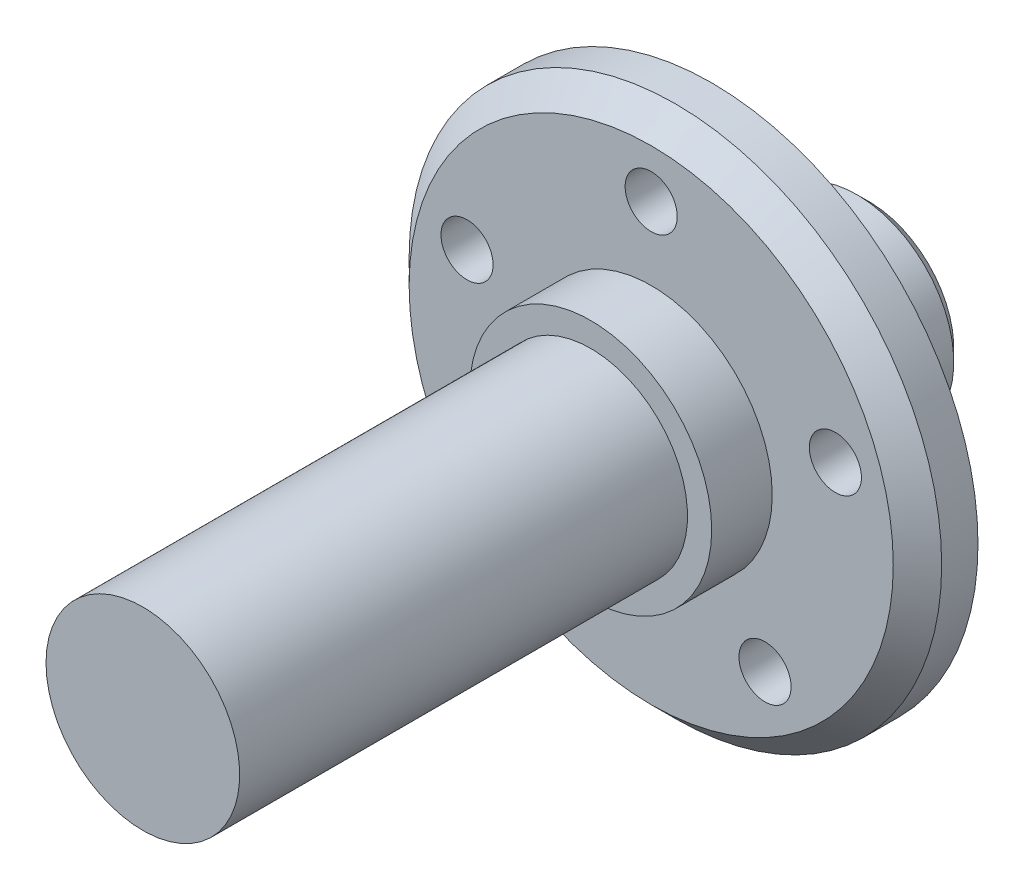
ISO-10303-21;
HEADER;
FILE_DESCRIPTION(('STEP AP214'),'2;1');
FILE_NAME('part.step','',(''),(''),'','','');
FILE_SCHEMA(('AUTOMOTIVE_DESIGN { 1 0 10303 214 1 1 1 1 }'));
ENDSEC;
DATA;
#1=APPLICATION_CONTEXT('core data for automotive mechanical design processes');
#2=APPLICATION_PROTOCOL_DEFINITION('international standard','automotive_design',2000,#1);
#3=PRODUCT_CONTEXT('',#1,'mechanical');
#4=PRODUCT('Part','Part','',(#3));
#5=PRODUCT_RELATED_PRODUCT_CATEGORY('part','',(#4));
#6=PRODUCT_DEFINITION_FORMATION('','',#4);
#7=PRODUCT_DEFINITION_CONTEXT('part definition',#1,'design');
#8=PRODUCT_DEFINITION('design','',#6,#7);
#9=PRODUCT_DEFINITION_SHAPE('','',#8);
#10=(LENGTH_UNIT() NAMED_UNIT(*) SI_UNIT(.MILLI.,.METRE.));
#11=(NAMED_UNIT(*) PLANE_ANGLE_UNIT() SI_UNIT($,.RADIAN.));
#12=(NAMED_UNIT(*) SI_UNIT($,.STERADIAN.) SOLID_ANGLE_UNIT());
#13=UNCERTAINTY_MEASURE_WITH_UNIT(LENGTH_MEASURE(1.E-05),#10,'distance_accuracy_value','');
#14=(GEOMETRIC_REPRESENTATION_CONTEXT(3) GLOBAL_UNCERTAINTY_ASSIGNED_CONTEXT((#13)) GLOBAL_UNIT_ASSIGNED_CONTEXT((#10,
#11,#12)) REPRESENTATION_CONTEXT('',''));
#15=CARTESIAN_POINT('',(0.,0.,0.));
#16=DIRECTION('',(0.,0.,1.));
#17=DIRECTION('',(1.,0.,0.));
#18=AXIS2_PLACEMENT_3D('',#15,#16,#17);
#19=CARTESIAN_POINT('',(0.,0.,0.));
#20=DIRECTION('',(0.,0.,1.));
#21=DIRECTION('',(1.,0.,0.));
#22=AXIS2_PLACEMENT_3D('',#19,#20,#21);
#23=PLANE('',#22);
#24=CARTESIAN_POINT('',(0.,0.,0.));
#25=DIRECTION('',(0.,0.,-1.));
#26=DIRECTION('',(-1.,0.,0.));
#27=AXIS2_PLACEMENT_3D('',#24,#25,#26);
#28=CIRCLE('',#27,8.);
#29=CARTESIAN_POINT('',(-8.,0.,0.));
#30=VERTEX_POINT('',#29);
#31=EDGE_CURVE('E81',#30,#30,#28,.T.);
#32=ORIENTED_EDGE('',*,*,#31,.F.);
#33=EDGE_LOOP('',(#32));
#34=FACE_BOUND('',#33,.T.);
#35=ADVANCED_FACE('F39',(#34),#23,.T.);
#36=CARTESIAN_POINT('',(0.,0.,-60.));
#37=DIRECTION('',(0.,0.,-1.));
#38=DIRECTION('',(-1.,0.,0.));
#39=AXIS2_PLACEMENT_3D('',#36,#37,#38);
#40=CYLINDRICAL_SURFACE('',#39,8.);
#41=ORIENTED_EDGE('',*,*,#31,.T.);
#42=EDGE_LOOP('',(#41));
#43=FACE_BOUND('',#42,.T.);
#44=CARTESIAN_POINT('',(0.,0.,-37.));
#45=DIRECTION('',(0.,0.,-1.));
#46=DIRECTION('',(-1.,0.,0.));
#47=AXIS2_PLACEMENT_3D('',#44,#45,#46);
#48=CIRCLE('',#47,8.);
#49=CARTESIAN_POINT('',(-8.,0.,-37.));
#50=VERTEX_POINT('',#49);
#51=EDGE_CURVE('E84',#50,#50,#48,.T.);
#52=ORIENTED_EDGE('',*,*,#51,.F.);
#53=EDGE_LOOP('',(#52));
#54=FACE_BOUND('',#53,.T.);
#55=ADVANCED_FACE('F137',(#43,#54),#40,.T.);
#56=CARTESIAN_POINT('',(-8.,0.,-37.));
#57=DIRECTION('',(0.,0.,1.));
#58=DIRECTION('',(1.,0.,0.));
#59=AXIS2_PLACEMENT_3D('',#56,#57,#58);
#60=PLANE('',#59);
#61=ORIENTED_EDGE('',*,*,#51,.T.);
#62=EDGE_LOOP('',(#61));
#63=FACE_BOUND('',#62,.T.);
#64=CARTESIAN_POINT('',(0.,0.,-37.));
#65=DIRECTION('',(0.,0.,-1.));
#66=DIRECTION('',(-1.,0.,0.));
#67=AXIS2_PLACEMENT_3D('',#64,#65,#66);
#68=CIRCLE('',#67,10.);
#69=CARTESIAN_POINT('',(-9.99999999999999,0.,-37.));
#70=VERTEX_POINT('',#69);
#71=EDGE_CURVE('E87',#70,#70,#68,.T.);
#72=ORIENTED_EDGE('',*,*,#71,.F.);
#73=EDGE_LOOP('',(#72));
#74=FACE_BOUND('',#73,.T.);
#75=ADVANCED_FACE('F130',(#63,#74),#60,.T.);
#76=CARTESIAN_POINT('',(0.,0.,-60.));
#77=DIRECTION('',(0.,0.,-1.));
#78=DIRECTION('',(-1.,0.,0.));
#79=AXIS2_PLACEMENT_3D('',#76,#77,#78);
#80=CYLINDRICAL_SURFACE('',#79,10.);
#81=ORIENTED_EDGE('',*,*,#71,.T.);
#82=EDGE_LOOP('',(#81));
#83=FACE_BOUND('',#82,.T.);
#84=CARTESIAN_POINT('',(0.,0.,-42.));
#85=DIRECTION('',(0.,0.,-1.));
#86=DIRECTION('',(-1.,0.,0.));
#87=AXIS2_PLACEMENT_3D('',#84,#85,#86);
#88=CIRCLE('',#87,10.);
#89=CARTESIAN_POINT('',(-10.,0.,-42.));
#90=VERTEX_POINT('',#89);
#91=EDGE_CURVE('E90',#90,#90,#88,.T.);
#92=ORIENTED_EDGE('',*,*,#91,.F.);
#93=EDGE_LOOP('',(#92));
#94=FACE_BOUND('',#93,.T.);
#95=ADVANCED_FACE('F115',(#83,#94),#80,.T.);
#96=CARTESIAN_POINT('',(-10.,0.,-42.));
#97=DIRECTION('',(0.,0.,1.));
#98=DIRECTION('',(1.,0.,0.));
#99=AXIS2_PLACEMENT_3D('',#96,#97,#98);
#100=PLANE('',#99);
#101=CARTESIAN_POINT('',(0.,15.9999999999998,-42.));
#102=DIRECTION('',(0.,0.,1.));
#103=DIRECTION('',(1.,0.,0.));
#104=AXIS2_PLACEMENT_3D('',#101,#102,#103);
#105=CIRCLE('',#104,2.15265);
#106=CARTESIAN_POINT('',(2.15265,15.9999999999998,-42.));
#107=VERTEX_POINT('',#106);
#108=EDGE_CURVE('E62',#107,#107,#105,.T.);
#109=ORIENTED_EDGE('',*,*,#108,.F.);
#110=EDGE_LOOP('',(#109));
#111=FACE_BOUND('',#110,.T.);
#112=CARTESIAN_POINT('',(15.2169042607225,4.94427190999901,-42.));
#113=DIRECTION('',(0.,0.,1.));
#114=DIRECTION('',(1.,0.,0.));
#115=AXIS2_PLACEMENT_3D('',#112,#113,#114);
#116=CIRCLE('',#115,2.15265);
#117=CARTESIAN_POINT('',(17.3695542607225,4.94427190999901,-42.));
#118=VERTEX_POINT('',#117);
#119=EDGE_CURVE('E61',#118,#118,#116,.T.);
#120=ORIENTED_EDGE('',*,*,#119,.F.);
#121=EDGE_LOOP('',(#120));
#122=FACE_BOUND('',#121,.T.);
#123=CARTESIAN_POINT('',(9.40456403667958,-12.9442719099993,-42.));
#124=DIRECTION('',(0.,0.,1.));
#125=DIRECTION('',(1.,0.,0.));
#126=AXIS2_PLACEMENT_3D('',#123,#124,#125);
#127=CIRCLE('',#126,2.15265);
#128=CARTESIAN_POINT('',(11.5572140366796,-12.9442719099993,-42.));
#129=VERTEX_POINT('',#128);
#130=EDGE_CURVE('E66',#129,#129,#127,.T.);
#131=ORIENTED_EDGE('',*,*,#130,.F.);
#132=EDGE_LOOP('',(#131));
#133=FACE_BOUND('',#132,.T.);
#134=CARTESIAN_POINT('',(-9.40456403667957,-12.9442719099993,-42.));
#135=DIRECTION('',(0.,0.,1.));
#136=DIRECTION('',(1.,0.,0.));
#137=AXIS2_PLACEMENT_3D('',#134,#135,#136);
#138=CIRCLE('',#137,2.15265);
#139=CARTESIAN_POINT('',(-7.25191403667957,-12.9442719099993,-42.));
#140=VERTEX_POINT('',#139);
#141=EDGE_CURVE('E70',#140,#140,#138,.T.);
#142=ORIENTED_EDGE('',*,*,#141,.F.);
#143=EDGE_LOOP('',(#142));
#144=FACE_BOUND('',#143,.T.);
#145=CARTESIAN_POINT('',(-15.2169042607225,4.94427190999901,-42.));
#146=DIRECTION('',(0.,0.,1.));
#147=DIRECTION('',(1.,0.,0.));
#148=AXIS2_PLACEMENT_3D('',#145,#146,#147);
#149=CIRCLE('',#148,2.15265);
#150=CARTESIAN_POINT('',(-13.0642542607225,4.94427190999901,-42.));
#151=VERTEX_POINT('',#150);
#152=EDGE_CURVE('E74',#151,#151,#149,.T.);
#153=ORIENTED_EDGE('',*,*,#152,.F.);
#154=EDGE_LOOP('',(#153));
#155=FACE_BOUND('',#154,.T.);
#156=CARTESIAN_POINT('',(0.,0.,-42.));
#157=DIRECTION('',(0.,0.,1.));
#158=DIRECTION('',(1.,0.,0.));
#159=AXIS2_PLACEMENT_3D('',#156,#157,#158);
#160=CIRCLE('',#159,20.);
#161=CARTESIAN_POINT('',(20.,0.,-42.));
#162=VERTEX_POINT('',#161);
#163=EDGE_CURVE('E51',#162,#162,#160,.T.);
#164=ORIENTED_EDGE('',*,*,#163,.T.);
#165=EDGE_LOOP('',(#164));
#166=FACE_BOUND('',#165,.T.);
#167=ORIENTED_EDGE('',*,*,#91,.T.);
#168=EDGE_LOOP('',(#167));
#169=FACE_BOUND('',#168,.T.);
#170=ADVANCED_FACE('F111',(#111,#122,#133,#144,#155,#166,#169),#100,.T.);
#171=CARTESIAN_POINT('',(0.,0.,-60.));
#172=DIRECTION('',(0.,0.,-1.));
#173=DIRECTION('',(-1.,0.,0.));
#174=AXIS2_PLACEMENT_3D('',#171,#172,#173);
#175=CYLINDRICAL_SURFACE('',#174,22.);
#176=CARTESIAN_POINT('',(0.,0.,-44.));
#177=DIRECTION('',(0.,0.,1.));
#178=DIRECTION('',(1.,0.,0.));
#179=AXIS2_PLACEMENT_3D('',#176,#177,#178);
#180=CIRCLE('',#179,22.);
#181=CARTESIAN_POINT('',(22.,0.,-44.));
#182=VERTEX_POINT('',#181);
#183=EDGE_CURVE('E55',#182,#182,#180,.F.);
#184=ORIENTED_EDGE('',*,*,#183,.T.);
#185=EDGE_LOOP('',(#184));
#186=FACE_BOUND('',#185,.T.);
#187=CARTESIAN_POINT('',(0.,0.,-47.));
#188=DIRECTION('',(0.,0.,-1.));
#189=DIRECTION('',(-1.,0.,0.));
#190=AXIS2_PLACEMENT_3D('',#187,#188,#189);
#191=CIRCLE('',#190,22.);
#192=CARTESIAN_POINT('',(-22.,0.,-47.));
#193=VERTEX_POINT('',#192);
#194=EDGE_CURVE('E93',#193,#193,#191,.T.);
#195=ORIENTED_EDGE('',*,*,#194,.F.);
#196=EDGE_LOOP('',(#195));
#197=FACE_BOUND('',#196,.T.);
#198=ADVANCED_FACE('F114',(#186,#197),#175,.T.);
#199=CARTESIAN_POINT('',(-22.,0.,-47.));
#200=DIRECTION('',(0.,0.,-1.));
#201=DIRECTION('',(-1.,0.,0.));
#202=AXIS2_PLACEMENT_3D('',#199,#200,#201);
#203=PLANE('',#202);
#204=CARTESIAN_POINT('',(0.,15.9999999999998,-47.));
#205=DIRECTION('',(0.,0.,-1.));
#206=DIRECTION('',(-1.,0.,0.));
#207=AXIS2_PLACEMENT_3D('',#204,#205,#206);
#208=CIRCLE('',#207,2.15265);
#209=CARTESIAN_POINT('',(-2.15265,15.9999999999998,-47.));
#210=VERTEX_POINT('',#209);
#211=EDGE_CURVE('E58',#210,#210,#208,.T.);
#212=ORIENTED_EDGE('',*,*,#211,.F.);
#213=EDGE_LOOP('',(#212));
#214=FACE_BOUND('',#213,.T.);
#215=CARTESIAN_POINT('',(15.2169042607225,4.94427190999901,-47.));
#216=DIRECTION('',(0.,0.,-1.));
#217=DIRECTION('',(-1.,0.,0.));
#218=AXIS2_PLACEMENT_3D('',#215,#216,#217);
#219=CIRCLE('',#218,2.15265);
#220=CARTESIAN_POINT('',(13.0642542607225,4.94427190999901,-47.));
#221=VERTEX_POINT('',#220);
#222=EDGE_CURVE('E63',#221,#221,#219,.T.);
#223=ORIENTED_EDGE('',*,*,#222,.F.);
#224=EDGE_LOOP('',(#223));
#225=FACE_BOUND('',#224,.T.);
#226=CARTESIAN_POINT('',(9.40456403667958,-12.9442719099993,-47.));
#227=DIRECTION('',(0.,0.,-1.));
#228=DIRECTION('',(-1.,0.,0.));
#229=AXIS2_PLACEMENT_3D('',#226,#227,#228);
#230=CIRCLE('',#229,2.15265);
#231=CARTESIAN_POINT('',(7.25191403667958,-12.9442719099993,-47.));
#232=VERTEX_POINT('',#231);
#233=EDGE_CURVE('E67',#232,#232,#230,.T.);
#234=ORIENTED_EDGE('',*,*,#233,.F.);
#235=EDGE_LOOP('',(#234));
#236=FACE_BOUND('',#235,.T.);
#237=CARTESIAN_POINT('',(-9.40456403667957,-12.9442719099993,-47.));
#238=DIRECTION('',(0.,0.,-1.));
#239=DIRECTION('',(-1.,0.,0.));
#240=AXIS2_PLACEMENT_3D('',#237,#238,#239);
#241=CIRCLE('',#240,2.15265);
#242=CARTESIAN_POINT('',(-11.5572140366796,-12.9442719099993,-47.));
#243=VERTEX_POINT('',#242);
#244=EDGE_CURVE('E71',#243,#243,#241,.T.);
#245=ORIENTED_EDGE('',*,*,#244,.F.);
#246=EDGE_LOOP('',(#245));
#247=FACE_BOUND('',#246,.T.);
#248=CARTESIAN_POINT('',(-15.2169042607225,4.94427190999901,-47.));
#249=DIRECTION('',(0.,0.,-1.));
#250=DIRECTION('',(-1.,0.,0.));
#251=AXIS2_PLACEMENT_3D('',#248,#249,#250);
#252=CIRCLE('',#251,2.15265);
#253=CARTESIAN_POINT('',(-17.3695542607225,4.94427190999901,-47.));
#254=VERTEX_POINT('',#253);
#255=EDGE_CURVE('E75',#254,#254,#252,.T.);
#256=ORIENTED_EDGE('',*,*,#255,.F.);
#257=EDGE_LOOP('',(#256));
#258=FACE_BOUND('',#257,.T.);
#259=ORIENTED_EDGE('',*,*,#194,.T.);
#260=EDGE_LOOP('',(#259));
#261=FACE_BOUND('',#260,.T.);
#262=CARTESIAN_POINT('',(0.,0.,-47.));
#263=DIRECTION('',(0.,0.,-1.));
#264=DIRECTION('',(-1.,0.,0.));
#265=AXIS2_PLACEMENT_3D('',#262,#263,#264);
#266=CIRCLE('',#265,8.);
#267=CARTESIAN_POINT('',(-8.,0.,-47.));
#268=VERTEX_POINT('',#267);
#269=EDGE_CURVE('E77',#268,#268,#266,.T.);
#270=ORIENTED_EDGE('',*,*,#269,.F.);
#271=EDGE_LOOP('',(#270));
#272=FACE_BOUND('',#271,.T.);
#273=ADVANCED_FACE('F170',(#214,#225,#236,#247,#258,#261,#272),#203,.T.);
#274=CARTESIAN_POINT('',(0.,0.,-60.));
#275=DIRECTION('',(0.,0.,-1.));
#276=DIRECTION('',(-1.,0.,0.));
#277=AXIS2_PLACEMENT_3D('',#274,#275,#276);
#278=CYLINDRICAL_SURFACE('',#277,8.);
#279=CARTESIAN_POINT('',(0.,0.,-59.));
#280=DIRECTION('',(0.,0.,-1.));
#281=DIRECTION('',(-1.,0.,0.));
#282=AXIS2_PLACEMENT_3D('',#279,#280,#281);
#283=CIRCLE('',#282,8.);
#284=CARTESIAN_POINT('',(-8.,0.,-59.));
#285=VERTEX_POINT('',#284);
#286=EDGE_CURVE('E10',#285,#285,#283,.F.);
#287=ORIENTED_EDGE('',*,*,#286,.T.);
#288=EDGE_LOOP('',(#287));
#289=FACE_BOUND('',#288,.T.);
#290=ORIENTED_EDGE('',*,*,#269,.T.);
#291=EDGE_LOOP('',(#290));
#292=FACE_BOUND('',#291,.T.);
#293=ADVANCED_FACE('F164',(#289,#292),#278,.T.);
#294=CARTESIAN_POINT('',(-8.,0.,-60.));
#295=DIRECTION('',(0.,0.,-1.));
#296=DIRECTION('',(-1.,0.,0.));
#297=AXIS2_PLACEMENT_3D('',#294,#295,#296);
#298=PLANE('',#297);
#299=CARTESIAN_POINT('',(0.,0.,-60.));
#300=DIRECTION('',(0.,0.,-1.));
#301=DIRECTION('',(-1.,0.,0.));
#302=AXIS2_PLACEMENT_3D('',#299,#300,#301);
#303=CIRCLE('',#302,6.99999999999999);
#304=CARTESIAN_POINT('',(-6.99999999999998,0.,-60.));
#305=VERTEX_POINT('',#304);
#306=EDGE_CURVE('E47',#305,#305,#303,.T.);
#307=ORIENTED_EDGE('',*,*,#306,.T.);
#308=EDGE_LOOP('',(#307));
#309=FACE_BOUND('',#308,.T.);
#310=ADVANCED_FACE('F155',(#309),#298,.T.);
#311=CARTESIAN_POINT('',(0.,0.,-44.));
#312=DIRECTION('',(0.,0.,-1.));
#313=DIRECTION('',(-1.,0.,0.));
#314=AXIS2_PLACEMENT_3D('',#311,#312,#313);
#315=CONICAL_SURFACE('',#314,22.,0.78539816339745);
#316=ORIENTED_EDGE('',*,*,#163,.F.);
#317=EDGE_LOOP('',(#316));
#318=FACE_BOUND('',#317,.T.);
#319=ORIENTED_EDGE('',*,*,#183,.F.);
#320=EDGE_LOOP('',(#319));
#321=FACE_BOUND('',#320,.T.);
#322=ADVANCED_FACE('F150',(#318,#321),#315,.T.);
#323=CARTESIAN_POINT('',(-15.2169042607225,4.94427190999901,-42.));
#324=DIRECTION('',(0.,0.,1.));
#325=DIRECTION('',(1.,0.,0.));
#326=AXIS2_PLACEMENT_3D('',#323,#324,#325);
#327=CYLINDRICAL_SURFACE('',#326,2.15265);
#328=ORIENTED_EDGE('',*,*,#255,.T.);
#329=EDGE_LOOP('',(#328));
#330=FACE_BOUND('',#329,.T.);
#331=ORIENTED_EDGE('',*,*,#152,.T.);
#332=EDGE_LOOP('',(#331));
#333=FACE_BOUND('',#332,.T.);
#334=ADVANCED_FACE('F154',(#330,#333),#327,.F.);
#335=CARTESIAN_POINT('',(-9.40456403667957,-12.9442719099993,-42.));
#336=DIRECTION('',(0.,0.,1.));
#337=DIRECTION('',(1.,0.,0.));
#338=AXIS2_PLACEMENT_3D('',#335,#336,#337);
#339=CYLINDRICAL_SURFACE('',#338,2.15265);
#340=ORIENTED_EDGE('',*,*,#244,.T.);
#341=EDGE_LOOP('',(#340));
#342=FACE_BOUND('',#341,.T.);
#343=ORIENTED_EDGE('',*,*,#141,.T.);
#344=EDGE_LOOP('',(#343));
#345=FACE_BOUND('',#344,.T.);
#346=ADVANCED_FACE('F160',(#342,#345),#339,.F.);
#347=CARTESIAN_POINT('',(9.40456403667958,-12.9442719099993,-42.));
#348=DIRECTION('',(0.,0.,1.));
#349=DIRECTION('',(1.,0.,0.));
#350=AXIS2_PLACEMENT_3D('',#347,#348,#349);
#351=CYLINDRICAL_SURFACE('',#350,2.15265);
#352=ORIENTED_EDGE('',*,*,#233,.T.);
#353=EDGE_LOOP('',(#352));
#354=FACE_BOUND('',#353,.T.);
#355=ORIENTED_EDGE('',*,*,#130,.T.);
#356=EDGE_LOOP('',(#355));
#357=FACE_BOUND('',#356,.T.);
#358=ADVANCED_FACE('F188',(#354,#357),#351,.F.);
#359=CARTESIAN_POINT('',(15.2169042607225,4.94427190999901,-42.));
#360=DIRECTION('',(0.,0.,1.));
#361=DIRECTION('',(1.,0.,0.));
#362=AXIS2_PLACEMENT_3D('',#359,#360,#361);
#363=CYLINDRICAL_SURFACE('',#362,2.15265);
#364=ORIENTED_EDGE('',*,*,#222,.T.);
#365=EDGE_LOOP('',(#364));
#366=FACE_BOUND('',#365,.T.);
#367=ORIENTED_EDGE('',*,*,#119,.T.);
#368=EDGE_LOOP('',(#367));
#369=FACE_BOUND('',#368,.T.);
#370=ADVANCED_FACE('F192',(#366,#369),#363,.F.);
#371=CARTESIAN_POINT('',(0.,15.9999999999998,-42.));
#372=DIRECTION('',(0.,0.,1.));
#373=DIRECTION('',(1.,0.,0.));
#374=AXIS2_PLACEMENT_3D('',#371,#372,#373);
#375=CYLINDRICAL_SURFACE('',#374,2.15265);
#376=ORIENTED_EDGE('',*,*,#211,.T.);
#377=EDGE_LOOP('',(#376));
#378=FACE_BOUND('',#377,.T.);
#379=ORIENTED_EDGE('',*,*,#108,.T.);
#380=EDGE_LOOP('',(#379));
#381=FACE_BOUND('',#380,.T.);
#382=ADVANCED_FACE('F109',(#378,#381),#375,.F.);
#383=CARTESIAN_POINT('',(0.,0.,-60.));
#384=DIRECTION('',(0.,0.,1.));
#385=DIRECTION('',(1.,0.,0.));
#386=AXIS2_PLACEMENT_3D('',#383,#384,#385);
#387=CONICAL_SURFACE('',#386,6.99999999999999,0.785398163397445);
#388=ORIENTED_EDGE('',*,*,#286,.F.);
#389=EDGE_LOOP('',(#388));
#390=FACE_BOUND('',#389,.T.);
#391=ORIENTED_EDGE('',*,*,#306,.F.);
#392=EDGE_LOOP('',(#391));
#393=FACE_BOUND('',#392,.T.);
#394=ADVANCED_FACE('F42',(#390,#393),#387,.T.);
#395=CLOSED_SHELL('',(#35,#55,#75,#95,#170,#198,#273,#293,#310,#322,#334,#346,#358,#370,#382,#394));
#396=MANIFOLD_SOLID_BREP('B2',#395);
#397=ADVANCED_BREP_SHAPE_REPRESENTATION('',(#18,#396),#14);
#398=SHAPE_DEFINITION_REPRESENTATION(#9,#397);
ENDSEC;
END-ISO-10303-21;
